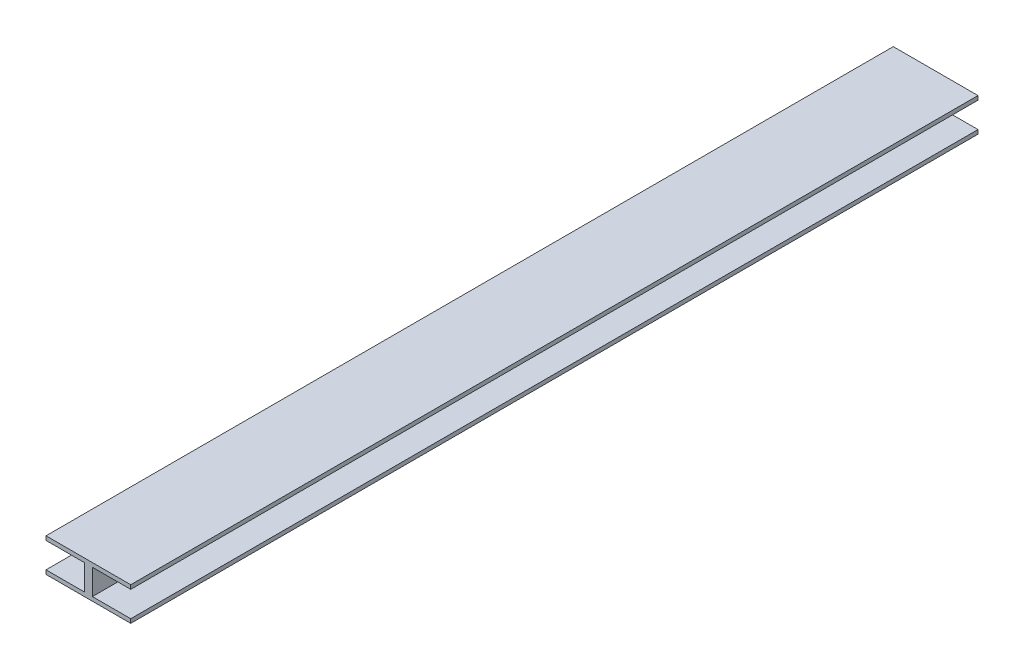
ISO-10303-21;
HEADER;
FILE_DESCRIPTION(('STEP AP214'),'2;1');
FILE_NAME('part.step','',(''),(''),'','','');
FILE_SCHEMA(('AUTOMOTIVE_DESIGN { 1 0 10303 214 1 1 1 1 }'));
ENDSEC;
DATA;
#1=APPLICATION_CONTEXT('core data for automotive mechanical design processes');
#2=APPLICATION_PROTOCOL_DEFINITION('international standard','automotive_design',2000,#1);
#3=PRODUCT_CONTEXT('',#1,'mechanical');
#4=PRODUCT('Part','Part','',(#3));
#5=PRODUCT_RELATED_PRODUCT_CATEGORY('part','',(#4));
#6=PRODUCT_DEFINITION_FORMATION('','',#4);
#7=PRODUCT_DEFINITION_CONTEXT('part definition',#1,'design');
#8=PRODUCT_DEFINITION('design','',#6,#7);
#9=PRODUCT_DEFINITION_SHAPE('','',#8);
#10=(LENGTH_UNIT() NAMED_UNIT(*) SI_UNIT(.MILLI.,.METRE.));
#11=(NAMED_UNIT(*) PLANE_ANGLE_UNIT() SI_UNIT($,.RADIAN.));
#12=(NAMED_UNIT(*) SI_UNIT($,.STERADIAN.) SOLID_ANGLE_UNIT());
#13=UNCERTAINTY_MEASURE_WITH_UNIT(LENGTH_MEASURE(1.E-05),#10,'distance_accuracy_value','');
#14=(GEOMETRIC_REPRESENTATION_CONTEXT(3) GLOBAL_UNCERTAINTY_ASSIGNED_CONTEXT((#13)) GLOBAL_UNIT_ASSIGNED_CONTEXT((#10,
#11,#12)) REPRESENTATION_CONTEXT('',''));
#15=CARTESIAN_POINT('',(0.,0.,0.));
#16=DIRECTION('',(0.,0.,1.));
#17=DIRECTION('',(1.,0.,0.));
#18=AXIS2_PLACEMENT_3D('',#15,#16,#17);
#19=CARTESIAN_POINT('',(-50.,0.,500.));
#20=DIRECTION('',(-1.,0.,0.));
#21=DIRECTION('',(0.,0.,1.));
#22=AXIS2_PLACEMENT_3D('',#19,#20,#21);
#23=PLANE('',#22);
#24=DIRECTION('',(0.,1.,0.));
#25=VECTOR('',#24,1.);
#26=CARTESIAN_POINT('',(-50.,0.,-500.));
#27=LINE('',#26,#25);
#28=CARTESIAN_POINT('',(-50.,-19.7625,-500.));
#29=VERTEX_POINT('',#28);
#30=CARTESIAN_POINT('',(-50.,-15.,-500.));
#31=VERTEX_POINT('',#30);
#32=EDGE_CURVE('E155',#29,#31,#27,.T.);
#33=ORIENTED_EDGE('',*,*,#32,.F.);
#34=DIRECTION('',(0.,0.,-1.));
#35=VECTOR('',#34,1.);
#36=CARTESIAN_POINT('',(-50.,-19.7625,500.));
#37=LINE('',#36,#35);
#38=CARTESIAN_POINT('',(-50.,-19.7625,500.));
#39=VERTEX_POINT('',#38);
#40=EDGE_CURVE('E11',#39,#29,#37,.T.);
#41=ORIENTED_EDGE('',*,*,#40,.F.);
#42=DIRECTION('',(0.,1.,0.));
#43=VECTOR('',#42,1.);
#44=CARTESIAN_POINT('',(-50.,0.,500.));
#45=LINE('',#44,#43);
#46=CARTESIAN_POINT('',(-50.,-15.,500.));
#47=VERTEX_POINT('',#46);
#48=EDGE_CURVE('E185',#39,#47,#45,.T.);
#49=ORIENTED_EDGE('',*,*,#48,.T.);
#50=DIRECTION('',(0.,0.,-1.));
#51=VECTOR('',#50,1.);
#52=CARTESIAN_POINT('',(-50.,-15.,500.));
#53=LINE('',#52,#51);
#54=EDGE_CURVE('E98',#47,#31,#53,.T.);
#55=ORIENTED_EDGE('',*,*,#54,.T.);
#56=EDGE_LOOP('',(#33,#41,#49,#55));
#57=FACE_BOUND('',#56,.T.);
#58=ADVANCED_FACE('F36',(#57),#23,.T.);
#59=CARTESIAN_POINT('',(0.,-19.7625,500.));
#60=DIRECTION('',(0.,1.,0.));
#61=DIRECTION('',(-1.,0.,0.));
#62=AXIS2_PLACEMENT_3D('',#59,#60,#61);
#63=PLANE('',#62);
#64=DIRECTION('',(1.,0.,0.));
#65=VECTOR('',#64,1.);
#66=CARTESIAN_POINT('',(0.,-19.7625,-500.));
#67=LINE('',#66,#65);
#68=CARTESIAN_POINT('',(50.,-19.7625,-500.));
#69=VERTEX_POINT('',#68);
#70=EDGE_CURVE('E158',#29,#69,#67,.T.);
#71=ORIENTED_EDGE('',*,*,#70,.T.);
#72=DIRECTION('',(0.,0.,-1.));
#73=VECTOR('',#72,1.);
#74=CARTESIAN_POINT('',(50.,-19.7625,500.));
#75=LINE('',#74,#73);
#76=CARTESIAN_POINT('',(50.,-19.7625,500.));
#77=VERTEX_POINT('',#76);
#78=EDGE_CURVE('E44',#77,#69,#75,.T.);
#79=ORIENTED_EDGE('',*,*,#78,.F.);
#80=DIRECTION('',(1.,0.,0.));
#81=VECTOR('',#80,1.);
#82=CARTESIAN_POINT('',(0.,-19.7625,500.));
#83=LINE('',#82,#81);
#84=EDGE_CURVE('E226',#39,#77,#83,.T.);
#85=ORIENTED_EDGE('',*,*,#84,.F.);
#86=ORIENTED_EDGE('',*,*,#40,.T.);
#87=EDGE_LOOP('',(#71,#79,#85,#86));
#88=FACE_BOUND('',#87,.T.);
#89=ADVANCED_FACE('F255',(#88),#63,.F.);
#90=CARTESIAN_POINT('',(50.,0.,500.));
#91=DIRECTION('',(-1.,0.,0.));
#92=DIRECTION('',(0.,0.,1.));
#93=AXIS2_PLACEMENT_3D('',#90,#91,#92);
#94=PLANE('',#93);
#95=DIRECTION('',(0.,1.,0.));
#96=VECTOR('',#95,1.);
#97=CARTESIAN_POINT('',(50.,0.,-500.));
#98=LINE('',#97,#96);
#99=CARTESIAN_POINT('',(50.,-15.,-500.));
#100=VERTEX_POINT('',#99);
#101=EDGE_CURVE('E160',#69,#100,#98,.T.);
#102=ORIENTED_EDGE('',*,*,#101,.T.);
#103=DIRECTION('',(0.,0.,-1.));
#104=VECTOR('',#103,1.);
#105=CARTESIAN_POINT('',(50.,-15.,500.));
#106=LINE('',#105,#104);
#107=CARTESIAN_POINT('',(50.,-15.,500.));
#108=VERTEX_POINT('',#107);
#109=EDGE_CURVE('E199',#108,#100,#106,.T.);
#110=ORIENTED_EDGE('',*,*,#109,.F.);
#111=DIRECTION('',(0.,1.,0.));
#112=VECTOR('',#111,1.);
#113=CARTESIAN_POINT('',(50.,0.,500.));
#114=LINE('',#113,#112);
#115=EDGE_CURVE('E207',#77,#108,#114,.T.);
#116=ORIENTED_EDGE('',*,*,#115,.F.);
#117=ORIENTED_EDGE('',*,*,#78,.T.);
#118=EDGE_LOOP('',(#102,#110,#116,#117));
#119=FACE_BOUND('',#118,.T.);
#120=ADVANCED_FACE('F205',(#119),#94,.F.);
#121=CARTESIAN_POINT('',(0.,-15.,500.));
#122=DIRECTION('',(0.,1.,0.));
#123=DIRECTION('',(-1.,0.,0.));
#124=AXIS2_PLACEMENT_3D('',#121,#122,#123);
#125=PLANE('',#124);
#126=DIRECTION('',(1.,0.,0.));
#127=VECTOR('',#126,1.);
#128=CARTESIAN_POINT('',(0.,-15.,-500.));
#129=LINE('',#128,#127);
#130=CARTESIAN_POINT('',(4.7625,-15.,-500.));
#131=VERTEX_POINT('',#130);
#132=EDGE_CURVE('E163',#131,#100,#129,.T.);
#133=ORIENTED_EDGE('',*,*,#132,.F.);
#134=DIRECTION('',(0.,0.,-1.));
#135=VECTOR('',#134,1.);
#136=CARTESIAN_POINT('',(4.7625,-15.,500.));
#137=LINE('',#136,#135);
#138=CARTESIAN_POINT('',(4.7625,-15.,500.));
#139=VERTEX_POINT('',#138);
#140=EDGE_CURVE('E197',#139,#131,#137,.T.);
#141=ORIENTED_EDGE('',*,*,#140,.F.);
#142=DIRECTION('',(1.,0.,0.));
#143=VECTOR('',#142,1.);
#144=CARTESIAN_POINT('',(0.,-15.,500.));
#145=LINE('',#144,#143);
#146=EDGE_CURVE('E219',#139,#108,#145,.T.);
#147=ORIENTED_EDGE('',*,*,#146,.T.);
#148=ORIENTED_EDGE('',*,*,#109,.T.);
#149=EDGE_LOOP('',(#133,#141,#147,#148));
#150=FACE_BOUND('',#149,.T.);
#151=ADVANCED_FACE('F216',(#150),#125,.T.);
#152=CARTESIAN_POINT('',(4.7625,0.,500.));
#153=DIRECTION('',(1.,0.,0.));
#154=DIRECTION('',(0.,1.,0.));
#155=AXIS2_PLACEMENT_3D('',#152,#153,#154);
#156=PLANE('',#155);
#157=DIRECTION('',(0.,-1.,0.));
#158=VECTOR('',#157,1.);
#159=CARTESIAN_POINT('',(4.7625,0.,-500.));
#160=LINE('',#159,#158);
#161=CARTESIAN_POINT('',(4.7625,15.,-500.));
#162=VERTEX_POINT('',#161);
#163=EDGE_CURVE('E166',#162,#131,#160,.T.);
#164=ORIENTED_EDGE('',*,*,#163,.F.);
#165=DIRECTION('',(0.,0.,-1.));
#166=VECTOR('',#165,1.);
#167=CARTESIAN_POINT('',(4.7625,15.,500.));
#168=LINE('',#167,#166);
#169=CARTESIAN_POINT('',(4.7625,15.,500.));
#170=VERTEX_POINT('',#169);
#171=EDGE_CURVE('E195',#170,#162,#168,.T.);
#172=ORIENTED_EDGE('',*,*,#171,.F.);
#173=DIRECTION('',(0.,-1.,0.));
#174=VECTOR('',#173,1.);
#175=CARTESIAN_POINT('',(4.7625,0.,500.));
#176=LINE('',#175,#174);
#177=EDGE_CURVE('E222',#170,#139,#176,.T.);
#178=ORIENTED_EDGE('',*,*,#177,.T.);
#179=ORIENTED_EDGE('',*,*,#140,.T.);
#180=EDGE_LOOP('',(#164,#172,#178,#179));
#181=FACE_BOUND('',#180,.T.);
#182=ADVANCED_FACE('F328',(#181),#156,.T.);
#183=CARTESIAN_POINT('',(0.,15.,500.));
#184=DIRECTION('',(0.,1.,0.));
#185=DIRECTION('',(-1.,0.,0.));
#186=AXIS2_PLACEMENT_3D('',#183,#184,#185);
#187=PLANE('',#186);
#188=DIRECTION('',(1.,0.,0.));
#189=VECTOR('',#188,1.);
#190=CARTESIAN_POINT('',(0.,15.,-500.));
#191=LINE('',#190,#189);
#192=CARTESIAN_POINT('',(50.,15.,-500.));
#193=VERTEX_POINT('',#192);
#194=EDGE_CURVE('E169',#162,#193,#191,.T.);
#195=ORIENTED_EDGE('',*,*,#194,.T.);
#196=DIRECTION('',(0.,0.,-1.));
#197=VECTOR('',#196,1.);
#198=CARTESIAN_POINT('',(50.,15.,500.));
#199=LINE('',#198,#197);
#200=CARTESIAN_POINT('',(50.,15.,500.));
#201=VERTEX_POINT('',#200);
#202=EDGE_CURVE('E193',#201,#193,#199,.T.);
#203=ORIENTED_EDGE('',*,*,#202,.F.);
#204=DIRECTION('',(1.,0.,0.));
#205=VECTOR('',#204,1.);
#206=CARTESIAN_POINT('',(0.,15.,500.));
#207=LINE('',#206,#205);
#208=EDGE_CURVE('E224',#170,#201,#207,.T.);
#209=ORIENTED_EDGE('',*,*,#208,.F.);
#210=ORIENTED_EDGE('',*,*,#171,.T.);
#211=EDGE_LOOP('',(#195,#203,#209,#210));
#212=FACE_BOUND('',#211,.T.);
#213=ADVANCED_FACE('F318',(#212),#187,.F.);
#214=CARTESIAN_POINT('',(50.,0.,500.));
#215=DIRECTION('',(1.,0.,0.));
#216=DIRECTION('',(0.,0.,-1.));
#217=AXIS2_PLACEMENT_3D('',#214,#215,#216);
#218=PLANE('',#217);
#219=DIRECTION('',(0.,-1.,0.));
#220=VECTOR('',#219,1.);
#221=CARTESIAN_POINT('',(50.,0.,-500.));
#222=LINE('',#221,#220);
#223=CARTESIAN_POINT('',(50.,19.7625,-500.));
#224=VERTEX_POINT('',#223);
#225=EDGE_CURVE('E172',#224,#193,#222,.T.);
#226=ORIENTED_EDGE('',*,*,#225,.F.);
#227=DIRECTION('',(0.,0.,-1.));
#228=VECTOR('',#227,1.);
#229=CARTESIAN_POINT('',(50.,19.7625,500.));
#230=LINE('',#229,#228);
#231=CARTESIAN_POINT('',(50.,19.7625,500.));
#232=VERTEX_POINT('',#231);
#233=EDGE_CURVE('E191',#232,#224,#230,.T.);
#234=ORIENTED_EDGE('',*,*,#233,.F.);
#235=DIRECTION('',(0.,-1.,0.));
#236=VECTOR('',#235,1.);
#237=CARTESIAN_POINT('',(50.,0.,500.));
#238=LINE('',#237,#236);
#239=EDGE_CURVE('E231',#232,#201,#238,.T.);
#240=ORIENTED_EDGE('',*,*,#239,.T.);
#241=ORIENTED_EDGE('',*,*,#202,.T.);
#242=EDGE_LOOP('',(#226,#234,#240,#241));
#243=FACE_BOUND('',#242,.T.);
#244=ADVANCED_FACE('F242',(#243),#218,.T.);
#245=CARTESIAN_POINT('',(0.,19.7625,500.));
#246=DIRECTION('',(0.,1.,0.));
#247=DIRECTION('',(-1.,0.,0.));
#248=AXIS2_PLACEMENT_3D('',#245,#246,#247);
#249=PLANE('',#248);
#250=DIRECTION('',(1.,0.,0.));
#251=VECTOR('',#250,1.);
#252=CARTESIAN_POINT('',(0.,19.7625,-500.));
#253=LINE('',#252,#251);
#254=CARTESIAN_POINT('',(-50.,19.7625,-500.));
#255=VERTEX_POINT('',#254);
#256=EDGE_CURVE('E175',#255,#224,#253,.T.);
#257=ORIENTED_EDGE('',*,*,#256,.F.);
#258=DIRECTION('',(0.,0.,-1.));
#259=VECTOR('',#258,1.);
#260=CARTESIAN_POINT('',(-50.,19.7625,500.));
#261=LINE('',#260,#259);
#262=CARTESIAN_POINT('',(-50.,19.7625,500.));
#263=VERTEX_POINT('',#262);
#264=EDGE_CURVE('E189',#263,#255,#261,.T.);
#265=ORIENTED_EDGE('',*,*,#264,.F.);
#266=DIRECTION('',(1.,0.,0.));
#267=VECTOR('',#266,1.);
#268=CARTESIAN_POINT('',(0.,19.7625,500.));
#269=LINE('',#268,#267);
#270=EDGE_CURVE('E150',#263,#232,#269,.T.);
#271=ORIENTED_EDGE('',*,*,#270,.T.);
#272=ORIENTED_EDGE('',*,*,#233,.T.);
#273=EDGE_LOOP('',(#257,#265,#271,#272));
#274=FACE_BOUND('',#273,.T.);
#275=ADVANCED_FACE('F236',(#274),#249,.T.);
#276=CARTESIAN_POINT('',(-50.,0.,500.));
#277=DIRECTION('',(1.,0.,0.));
#278=DIRECTION('',(0.,0.,-1.));
#279=AXIS2_PLACEMENT_3D('',#276,#277,#278);
#280=PLANE('',#279);
#281=DIRECTION('',(0.,-1.,0.));
#282=VECTOR('',#281,1.);
#283=CARTESIAN_POINT('',(-50.,0.,-500.));
#284=LINE('',#283,#282);
#285=CARTESIAN_POINT('',(-50.,15.,-500.));
#286=VERTEX_POINT('',#285);
#287=EDGE_CURVE('E178',#255,#286,#284,.T.);
#288=ORIENTED_EDGE('',*,*,#287,.T.);
#289=DIRECTION('',(0.,0.,-1.));
#290=VECTOR('',#289,1.);
#291=CARTESIAN_POINT('',(-50.,15.,500.));
#292=LINE('',#291,#290);
#293=CARTESIAN_POINT('',(-50.,15.,500.));
#294=VERTEX_POINT('',#293);
#295=EDGE_CURVE('E138',#294,#286,#292,.T.);
#296=ORIENTED_EDGE('',*,*,#295,.F.);
#297=DIRECTION('',(0.,-1.,0.));
#298=VECTOR('',#297,1.);
#299=CARTESIAN_POINT('',(-50.,0.,500.));
#300=LINE('',#299,#298);
#301=EDGE_CURVE('E147',#263,#294,#300,.T.);
#302=ORIENTED_EDGE('',*,*,#301,.F.);
#303=ORIENTED_EDGE('',*,*,#264,.T.);
#304=EDGE_LOOP('',(#288,#296,#302,#303));
#305=FACE_BOUND('',#304,.T.);
#306=ADVANCED_FACE('F245',(#305),#280,.F.);
#307=CARTESIAN_POINT('',(0.,15.,500.));
#308=DIRECTION('',(0.,-1.,0.));
#309=DIRECTION('',(1.,0.,0.));
#310=AXIS2_PLACEMENT_3D('',#307,#308,#309);
#311=PLANE('',#310);
#312=DIRECTION('',(-1.,0.,0.));
#313=VECTOR('',#312,1.);
#314=CARTESIAN_POINT('',(0.,15.,-500.));
#315=LINE('',#314,#313);
#316=CARTESIAN_POINT('',(-4.7625,15.,-500.));
#317=VERTEX_POINT('',#316);
#318=EDGE_CURVE('E137',#317,#286,#315,.T.);
#319=ORIENTED_EDGE('',*,*,#318,.F.);
#320=DIRECTION('',(0.,0.,-1.));
#321=VECTOR('',#320,1.);
#322=CARTESIAN_POINT('',(-4.7625,15.,500.));
#323=LINE('',#322,#321);
#324=CARTESIAN_POINT('',(-4.7625,15.,500.));
#325=VERTEX_POINT('',#324);
#326=EDGE_CURVE('E131',#325,#317,#323,.T.);
#327=ORIENTED_EDGE('',*,*,#326,.F.);
#328=DIRECTION('',(-1.,0.,0.));
#329=VECTOR('',#328,1.);
#330=CARTESIAN_POINT('',(0.,15.,500.));
#331=LINE('',#330,#329);
#332=EDGE_CURVE('E135',#325,#294,#331,.T.);
#333=ORIENTED_EDGE('',*,*,#332,.T.);
#334=ORIENTED_EDGE('',*,*,#295,.T.);
#335=EDGE_LOOP('',(#319,#327,#333,#334));
#336=FACE_BOUND('',#335,.T.);
#337=ADVANCED_FACE('F133',(#336),#311,.T.);
#338=CARTESIAN_POINT('',(-4.7625,0.,500.));
#339=DIRECTION('',(1.,0.,0.));
#340=DIRECTION('',(0.,1.,0.));
#341=AXIS2_PLACEMENT_3D('',#338,#339,#340);
#342=PLANE('',#341);
#343=DIRECTION('',(0.,-1.,0.));
#344=VECTOR('',#343,1.);
#345=CARTESIAN_POINT('',(-4.7625,0.,-500.));
#346=LINE('',#345,#344);
#347=CARTESIAN_POINT('',(-4.76249999999999,-15.,-500.));
#348=VERTEX_POINT('',#347);
#349=EDGE_CURVE('E91',#317,#348,#346,.T.);
#350=ORIENTED_EDGE('',*,*,#349,.T.);
#351=DIRECTION('',(0.,0.,-1.));
#352=VECTOR('',#351,1.);
#353=CARTESIAN_POINT('',(-4.76249999999999,-15.,500.));
#354=LINE('',#353,#352);
#355=CARTESIAN_POINT('',(-4.76249999999999,-15.,500.));
#356=VERTEX_POINT('',#355);
#357=EDGE_CURVE('E139',#356,#348,#354,.T.);
#358=ORIENTED_EDGE('',*,*,#357,.F.);
#359=DIRECTION('',(0.,-1.,0.));
#360=VECTOR('',#359,1.);
#361=CARTESIAN_POINT('',(-4.7625,0.,500.));
#362=LINE('',#361,#360);
#363=EDGE_CURVE('E141',#325,#356,#362,.T.);
#364=ORIENTED_EDGE('',*,*,#363,.F.);
#365=ORIENTED_EDGE('',*,*,#326,.T.);
#366=EDGE_LOOP('',(#350,#358,#364,#365));
#367=FACE_BOUND('',#366,.T.);
#368=ADVANCED_FACE('F142',(#367),#342,.F.);
#369=CARTESIAN_POINT('',(0.,-15.,500.));
#370=DIRECTION('',(0.,-1.,0.));
#371=DIRECTION('',(1.,0.,0.));
#372=AXIS2_PLACEMENT_3D('',#369,#370,#371);
#373=PLANE('',#372);
#374=DIRECTION('',(-1.,0.,0.));
#375=VECTOR('',#374,1.);
#376=CARTESIAN_POINT('',(0.,-15.,-500.));
#377=LINE('',#376,#375);
#378=EDGE_CURVE('E183',#348,#31,#377,.T.);
#379=ORIENTED_EDGE('',*,*,#378,.T.);
#380=ORIENTED_EDGE('',*,*,#54,.F.);
#381=DIRECTION('',(-1.,0.,0.));
#382=VECTOR('',#381,1.);
#383=CARTESIAN_POINT('',(0.,-15.,500.));
#384=LINE('',#383,#382);
#385=EDGE_CURVE('E52',#356,#47,#384,.T.);
#386=ORIENTED_EDGE('',*,*,#385,.F.);
#387=ORIENTED_EDGE('',*,*,#357,.T.);
#388=EDGE_LOOP('',(#379,#380,#386,#387));
#389=FACE_BOUND('',#388,.T.);
#390=ADVANCED_FACE('F261',(#389),#373,.F.);
#391=CARTESIAN_POINT('',(0.,0.,500.));
#392=DIRECTION('',(0.,0.,1.));
#393=DIRECTION('',(1.,0.,0.));
#394=AXIS2_PLACEMENT_3D('',#391,#392,#393);
#395=PLANE('',#394);
#396=ORIENTED_EDGE('',*,*,#48,.F.);
#397=ORIENTED_EDGE('',*,*,#84,.T.);
#398=ORIENTED_EDGE('',*,*,#115,.T.);
#399=ORIENTED_EDGE('',*,*,#146,.F.);
#400=ORIENTED_EDGE('',*,*,#177,.F.);
#401=ORIENTED_EDGE('',*,*,#208,.T.);
#402=ORIENTED_EDGE('',*,*,#239,.F.);
#403=ORIENTED_EDGE('',*,*,#270,.F.);
#404=ORIENTED_EDGE('',*,*,#301,.T.);
#405=ORIENTED_EDGE('',*,*,#332,.F.);
#406=ORIENTED_EDGE('',*,*,#363,.T.);
#407=ORIENTED_EDGE('',*,*,#385,.T.);
#408=EDGE_LOOP('',(#396,#397,#398,#399,#400,#401,#402,#403,#404,#405,#406,#407));
#409=FACE_BOUND('',#408,.T.);
#410=ADVANCED_FACE('F144',(#409),#395,.T.);
#411=CARTESIAN_POINT('',(0.,0.,-500.));
#412=DIRECTION('',(0.,0.,1.));
#413=DIRECTION('',(1.,0.,0.));
#414=AXIS2_PLACEMENT_3D('',#411,#412,#413);
#415=PLANE('',#414);
#416=ORIENTED_EDGE('',*,*,#32,.T.);
#417=ORIENTED_EDGE('',*,*,#378,.F.);
#418=ORIENTED_EDGE('',*,*,#349,.F.);
#419=ORIENTED_EDGE('',*,*,#318,.T.);
#420=ORIENTED_EDGE('',*,*,#287,.F.);
#421=ORIENTED_EDGE('',*,*,#256,.T.);
#422=ORIENTED_EDGE('',*,*,#225,.T.);
#423=ORIENTED_EDGE('',*,*,#194,.F.);
#424=ORIENTED_EDGE('',*,*,#163,.T.);
#425=ORIENTED_EDGE('',*,*,#132,.T.);
#426=ORIENTED_EDGE('',*,*,#101,.F.);
#427=ORIENTED_EDGE('',*,*,#70,.F.);
#428=EDGE_LOOP('',(#416,#417,#418,#419,#420,#421,#422,#423,#424,#425,#426,#427));
#429=FACE_BOUND('',#428,.T.);
#430=ADVANCED_FACE('F211',(#429),#415,.F.);
#431=CLOSED_SHELL('',(#58,#89,#120,#151,#182,#213,#244,#275,#306,#337,#368,#390,#410,#430));
#432=MANIFOLD_SOLID_BREP('B2',#431);
#433=ADVANCED_BREP_SHAPE_REPRESENTATION('',(#18,#432),#14);
#434=SHAPE_DEFINITION_REPRESENTATION(#9,#433);
ENDSEC;
END-ISO-10303-21;
